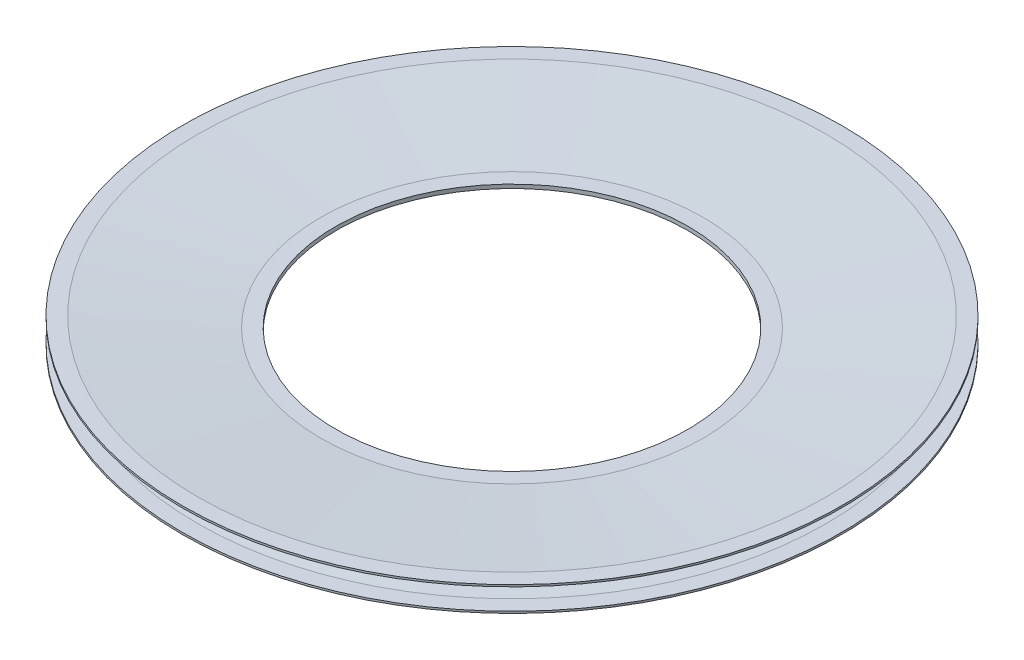
ISO-10303-21;
HEADER;
FILE_DESCRIPTION(('STEP AP214'),'2;1');
FILE_NAME('part.step','',(''),(''),'','','');
FILE_SCHEMA(('AUTOMOTIVE_DESIGN { 1 0 10303 214 1 1 1 1 }'));
ENDSEC;
DATA;
#1=APPLICATION_CONTEXT('core data for automotive mechanical design processes');
#2=APPLICATION_PROTOCOL_DEFINITION('international standard','automotive_design',2000,#1);
#3=PRODUCT_CONTEXT('',#1,'mechanical');
#4=PRODUCT('Part','Part','',(#3));
#5=PRODUCT_RELATED_PRODUCT_CATEGORY('part','',(#4));
#6=PRODUCT_DEFINITION_FORMATION('','',#4);
#7=PRODUCT_DEFINITION_CONTEXT('part definition',#1,'design');
#8=PRODUCT_DEFINITION('design','',#6,#7);
#9=PRODUCT_DEFINITION_SHAPE('','',#8);
#10=(LENGTH_UNIT() NAMED_UNIT(*) SI_UNIT(.MILLI.,.METRE.));
#11=(NAMED_UNIT(*) PLANE_ANGLE_UNIT() SI_UNIT($,.RADIAN.));
#12=(NAMED_UNIT(*) SI_UNIT($,.STERADIAN.) SOLID_ANGLE_UNIT());
#13=UNCERTAINTY_MEASURE_WITH_UNIT(LENGTH_MEASURE(1.E-05),#10,'distance_accuracy_value','');
#14=(GEOMETRIC_REPRESENTATION_CONTEXT(3) GLOBAL_UNCERTAINTY_ASSIGNED_CONTEXT((#13)) GLOBAL_UNIT_ASSIGNED_CONTEXT((#10,
#11,#12)) REPRESENTATION_CONTEXT('',''));
#15=CARTESIAN_POINT('',(0.,0.,0.));
#16=DIRECTION('',(0.,0.,1.));
#17=DIRECTION('',(1.,0.,0.));
#18=AXIS2_PLACEMENT_3D('',#15,#16,#17);
#19=CARTESIAN_POINT('',(0.,0.,0.));
#20=DIRECTION('',(0.,1.,0.));
#21=DIRECTION('',(0.,0.,-1.));
#22=AXIS2_PLACEMENT_3D('',#19,#20,#21);
#23=CYLINDRICAL_SURFACE('',#22,13.081);
#24=CARTESIAN_POINT('',(0.,14.4112109031421,0.));
#25=DIRECTION('',(0.,-1.,0.));
#26=DIRECTION('',(0.,0.,-1.));
#27=AXIS2_PLACEMENT_3D('',#24,#25,#26);
#28=CIRCLE('',#27,13.081);
#29=CARTESIAN_POINT('',(0.,14.4112109031421,-13.081));
#30=VERTEX_POINT('',#29);
#31=EDGE_CURVE('E11',#30,#30,#28,.T.);
#32=ORIENTED_EDGE('',*,*,#31,.F.);
#33=EDGE_LOOP('',(#32));
#34=FACE_BOUND('',#33,.T.);
#35=CARTESIAN_POINT('',(0.,14.4874109031421,0.));
#36=DIRECTION('',(0.,-1.,0.));
#37=DIRECTION('',(0.,0.,-1.));
#38=AXIS2_PLACEMENT_3D('',#35,#36,#37);
#39=CIRCLE('',#38,13.081);
#40=CARTESIAN_POINT('',(0.,14.4874109031421,-13.081));
#41=VERTEX_POINT('',#40);
#42=EDGE_CURVE('E90',#41,#41,#39,.T.);
#43=ORIENTED_EDGE('',*,*,#42,.T.);
#44=EDGE_LOOP('',(#43));
#45=FACE_BOUND('',#44,.T.);
#46=ADVANCED_FACE('F16',(#34,#45),#23,.T.);
#47=CARTESIAN_POINT('',(-12.4746660164987,15.3256109031421,0.));
#48=DIRECTION('',(0.,1.,0.));
#49=DIRECTION('',(1.,0.,0.));
#50=AXIS2_PLACEMENT_3D('',#47,#48,#49);
#51=PLANE('',#50);
#52=CARTESIAN_POINT('',(0.,15.3256109031421,0.));
#53=DIRECTION('',(0.,-1.,0.));
#54=DIRECTION('',(0.,0.,-1.));
#55=AXIS2_PLACEMENT_3D('',#52,#53,#54);
#56=CIRCLE('',#55,12.4746660164987);
#57=CARTESIAN_POINT('',(0.,15.3256109031421,-12.4746660164987));
#58=VERTEX_POINT('',#57);
#59=EDGE_CURVE('E79',#58,#58,#56,.T.);
#60=ORIENTED_EDGE('',*,*,#59,.F.);
#61=EDGE_LOOP('',(#60));
#62=FACE_BOUND('',#61,.T.);
#63=CARTESIAN_POINT('',(0.,15.3256109031421,0.));
#64=DIRECTION('',(0.,-1.,0.));
#65=DIRECTION('',(0.,0.,-1.));
#66=AXIS2_PLACEMENT_3D('',#63,#64,#65);
#67=CIRCLE('',#66,13.081);
#68=CARTESIAN_POINT('',(0.,15.3256109031421,-13.081));
#69=VERTEX_POINT('',#68);
#70=EDGE_CURVE('E99',#69,#69,#67,.T.);
#71=ORIENTED_EDGE('',*,*,#70,.T.);
#72=EDGE_LOOP('',(#71));
#73=FACE_BOUND('',#72,.T.);
#74=ADVANCED_FACE('F121',(#62,#73),#51,.F.);
#75=CARTESIAN_POINT('',(-12.4714,14.4112109031421,0.));
#76=DIRECTION('',(0.,1.,0.));
#77=DIRECTION('',(1.,0.,0.));
#78=AXIS2_PLACEMENT_3D('',#75,#76,#77);
#79=PLANE('',#78);
#80=CARTESIAN_POINT('',(0.,14.4112109031421,0.));
#81=DIRECTION('',(0.,-1.,0.));
#82=DIRECTION('',(0.,0.,-1.));
#83=AXIS2_PLACEMENT_3D('',#80,#81,#82);
#84=CIRCLE('',#83,12.4714);
#85=CARTESIAN_POINT('',(0.,14.4112109031421,-12.4714));
#86=VERTEX_POINT('',#85);
#87=EDGE_CURVE('E163',#86,#86,#84,.T.);
#88=ORIENTED_EDGE('',*,*,#87,.F.);
#89=EDGE_LOOP('',(#88));
#90=FACE_BOUND('',#89,.T.);
#91=ORIENTED_EDGE('',*,*,#31,.T.);
#92=EDGE_LOOP('',(#91));
#93=FACE_BOUND('',#92,.T.);
#94=ADVANCED_FACE('F111',(#90,#93),#79,.F.);
#95=CARTESIAN_POINT('',(0.,14.9065109031421,0.));
#96=DIRECTION('',(0.,-1.,0.));
#97=DIRECTION('',(0.,0.,-1.));
#98=AXIS2_PLACEMENT_3D('',#95,#96,#97);
#99=CONICAL_SURFACE('',#98,7.5946,1.48512654390186);
#100=CARTESIAN_POINT('',(0.,14.9065109031421,0.));
#101=DIRECTION('',(0.,-1.,0.));
#102=DIRECTION('',(0.,0.,-1.));
#103=AXIS2_PLACEMENT_3D('',#100,#101,#102);
#104=CIRCLE('',#103,7.5946);
#105=CARTESIAN_POINT('',(0.,14.9065109031421,-7.5946));
#106=VERTEX_POINT('',#105);
#107=EDGE_CURVE('E85',#106,#106,#104,.T.);
#108=ORIENTED_EDGE('',*,*,#107,.T.);
#109=EDGE_LOOP('',(#108));
#110=FACE_BOUND('',#109,.T.);
#111=CARTESIAN_POINT('',(0.,14.4874109031421,0.));
#112=DIRECTION('',(0.,-1.,0.));
#113=DIRECTION('',(0.,0.,-1.));
#114=AXIS2_PLACEMENT_3D('',#111,#112,#113);
#115=CIRCLE('',#114,12.4746660164987);
#116=CARTESIAN_POINT('',(0.,14.4874109031421,-12.4746660164987));
#117=VERTEX_POINT('',#116);
#118=EDGE_CURVE('E25',#117,#117,#115,.T.);
#119=ORIENTED_EDGE('',*,*,#118,.F.);
#120=EDGE_LOOP('',(#119));
#121=FACE_BOUND('',#120,.T.);
#122=ADVANCED_FACE('F86',(#110,#121),#99,.T.);
#123=CARTESIAN_POINT('',(-12.4746660164987,14.4874109031421,0.));
#124=DIRECTION('',(0.,-1.,0.));
#125=DIRECTION('',(0.,0.,-1.));
#126=AXIS2_PLACEMENT_3D('',#123,#124,#125);
#127=PLANE('',#126);
#128=ORIENTED_EDGE('',*,*,#118,.T.);
#129=EDGE_LOOP('',(#128));
#130=FACE_BOUND('',#129,.T.);
#131=ORIENTED_EDGE('',*,*,#42,.F.);
#132=EDGE_LOOP('',(#131));
#133=FACE_BOUND('',#132,.T.);
#134=ADVANCED_FACE('F108',(#130,#133),#127,.F.);
#135=CARTESIAN_POINT('',(-12.4714,15.4018109031422,0.));
#136=DIRECTION('',(0.,-1.,0.));
#137=DIRECTION('',(0.,0.,-1.));
#138=AXIS2_PLACEMENT_3D('',#135,#136,#137);
#139=PLANE('',#138);
#140=CARTESIAN_POINT('',(0.,15.4018109031422,0.));
#141=DIRECTION('',(0.,-1.,0.));
#142=DIRECTION('',(0.,0.,-1.));
#143=AXIS2_PLACEMENT_3D('',#140,#141,#142);
#144=CIRCLE('',#143,12.4714);
#145=CARTESIAN_POINT('',(0.,15.4018109031422,-12.4714));
#146=VERTEX_POINT('',#145);
#147=EDGE_CURVE('E159',#146,#146,#144,.T.);
#148=ORIENTED_EDGE('',*,*,#147,.T.);
#149=EDGE_LOOP('',(#148));
#150=FACE_BOUND('',#149,.T.);
#151=CARTESIAN_POINT('',(0.,15.4018109031422,0.));
#152=DIRECTION('',(0.,-1.,0.));
#153=DIRECTION('',(0.,0.,-1.));
#154=AXIS2_PLACEMENT_3D('',#151,#152,#153);
#155=CIRCLE('',#154,13.081);
#156=CARTESIAN_POINT('',(0.,15.4018109031422,-13.081));
#157=VERTEX_POINT('',#156);
#158=EDGE_CURVE('E102',#157,#157,#155,.T.);
#159=ORIENTED_EDGE('',*,*,#158,.F.);
#160=EDGE_LOOP('',(#159));
#161=FACE_BOUND('',#160,.T.);
#162=ADVANCED_FACE('F119',(#150,#161),#139,.F.);
#163=CARTESIAN_POINT('',(-6.985,14.9827109031421,0.));
#164=DIRECTION('',(0.,-1.,0.));
#165=DIRECTION('',(0.,0.,-1.));
#166=AXIS2_PLACEMENT_3D('',#163,#164,#165);
#167=PLANE('',#166);
#168=CARTESIAN_POINT('',(0.,14.9827109031421,0.));
#169=DIRECTION('',(0.,-1.,0.));
#170=DIRECTION('',(0.,0.,-1.));
#171=AXIS2_PLACEMENT_3D('',#168,#169,#170);
#172=CIRCLE('',#171,6.985);
#173=CARTESIAN_POINT('',(0.,14.9827109031421,-6.985));
#174=VERTEX_POINT('',#173);
#175=EDGE_CURVE('E154',#174,#174,#172,.T.);
#176=ORIENTED_EDGE('',*,*,#175,.T.);
#177=EDGE_LOOP('',(#176));
#178=FACE_BOUND('',#177,.T.);
#179=CARTESIAN_POINT('',(0.,14.9827109031421,0.));
#180=DIRECTION('',(0.,-1.,0.));
#181=DIRECTION('',(0.,0.,-1.));
#182=AXIS2_PLACEMENT_3D('',#179,#180,#181);
#183=CIRCLE('',#182,7.59133398350129);
#184=CARTESIAN_POINT('',(0.,14.9827109031421,-7.59133398350129));
#185=VERTEX_POINT('',#184);
#186=EDGE_CURVE('E156',#185,#185,#183,.T.);
#187=ORIENTED_EDGE('',*,*,#186,.F.);
#188=EDGE_LOOP('',(#187));
#189=FACE_BOUND('',#188,.T.);
#190=ADVANCED_FACE('F141',(#178,#189),#167,.F.);
#191=CARTESIAN_POINT('',(0.,15.3256109031421,0.));
#192=DIRECTION('',(0.,1.,0.));
#193=DIRECTION('',(0.,0.,1.));
#194=AXIS2_PLACEMENT_3D('',#191,#192,#193);
#195=CONICAL_SURFACE('',#194,12.4746660164987,1.48512654390186);
#196=ORIENTED_EDGE('',*,*,#107,.F.);
#197=EDGE_LOOP('',(#196));
#198=FACE_BOUND('',#197,.T.);
#199=ORIENTED_EDGE('',*,*,#59,.T.);
#200=EDGE_LOOP('',(#199));
#201=FACE_BOUND('',#200,.T.);
#202=ADVANCED_FACE('F144',(#198,#201),#195,.T.);
#203=CARTESIAN_POINT('',(0.,0.,0.));
#204=DIRECTION('',(0.,1.,0.));
#205=DIRECTION('',(0.,0.,-1.));
#206=AXIS2_PLACEMENT_3D('',#203,#204,#205);
#207=CYLINDRICAL_SURFACE('',#206,13.081);
#208=ORIENTED_EDGE('',*,*,#70,.F.);
#209=EDGE_LOOP('',(#208));
#210=FACE_BOUND('',#209,.T.);
#211=ORIENTED_EDGE('',*,*,#158,.T.);
#212=EDGE_LOOP('',(#211));
#213=FACE_BOUND('',#212,.T.);
#214=ADVANCED_FACE('F150',(#210,#213),#207,.T.);
#215=CARTESIAN_POINT('',(0.,14.9827109031421,0.));
#216=DIRECTION('',(0.,1.,0.));
#217=DIRECTION('',(0.,0.,1.));
#218=AXIS2_PLACEMENT_3D('',#215,#216,#217);
#219=CONICAL_SURFACE('',#218,7.59133398350129,1.48512654390186);
#220=ORIENTED_EDGE('',*,*,#186,.T.);
#221=EDGE_LOOP('',(#220));
#222=FACE_BOUND('',#221,.T.);
#223=ORIENTED_EDGE('',*,*,#147,.F.);
#224=EDGE_LOOP('',(#223));
#225=FACE_BOUND('',#224,.T.);
#226=ADVANCED_FACE('F249',(#222,#225),#219,.F.);
#227=CARTESIAN_POINT('',(0.,14.4112109031421,0.));
#228=DIRECTION('',(0.,-1.,0.));
#229=DIRECTION('',(0.,0.,-1.));
#230=AXIS2_PLACEMENT_3D('',#227,#228,#229);
#231=CONICAL_SURFACE('',#230,12.4714,1.48512654390186);
#232=CARTESIAN_POINT('',(0.,14.8303109031421,0.));
#233=DIRECTION('',(0.,-1.,0.));
#234=DIRECTION('',(0.,0.,-1.));
#235=AXIS2_PLACEMENT_3D('',#232,#233,#234);
#236=CIRCLE('',#235,7.59133398350129);
#237=CARTESIAN_POINT('',(0.,14.8303109031421,-7.59133398350129));
#238=VERTEX_POINT('',#237);
#239=EDGE_CURVE('E168',#238,#238,#236,.T.);
#240=ORIENTED_EDGE('',*,*,#239,.F.);
#241=EDGE_LOOP('',(#240));
#242=FACE_BOUND('',#241,.T.);
#243=ORIENTED_EDGE('',*,*,#87,.T.);
#244=EDGE_LOOP('',(#243));
#245=FACE_BOUND('',#244,.T.);
#246=ADVANCED_FACE('F240',(#242,#245),#231,.F.);
#247=CARTESIAN_POINT('',(-6.985,14.8303109031421,0.));
#248=DIRECTION('',(0.,1.,0.));
#249=DIRECTION('',(1.,0.,0.));
#250=AXIS2_PLACEMENT_3D('',#247,#248,#249);
#251=PLANE('',#250);
#252=CARTESIAN_POINT('',(0.,14.8303109031421,0.));
#253=DIRECTION('',(0.,-1.,0.));
#254=DIRECTION('',(0.,0.,-1.));
#255=AXIS2_PLACEMENT_3D('',#252,#253,#254);
#256=CIRCLE('',#255,6.985);
#257=CARTESIAN_POINT('',(0.,14.8303109031421,-6.985));
#258=VERTEX_POINT('',#257);
#259=EDGE_CURVE('E173',#258,#258,#256,.T.);
#260=ORIENTED_EDGE('',*,*,#259,.F.);
#261=EDGE_LOOP('',(#260));
#262=FACE_BOUND('',#261,.T.);
#263=ORIENTED_EDGE('',*,*,#239,.T.);
#264=EDGE_LOOP('',(#263));
#265=FACE_BOUND('',#264,.T.);
#266=ADVANCED_FACE('F221',(#262,#265),#251,.F.);
#267=CARTESIAN_POINT('',(0.,0.,0.));
#268=DIRECTION('',(0.,1.,0.));
#269=DIRECTION('',(0.,0.,-1.));
#270=AXIS2_PLACEMENT_3D('',#267,#268,#269);
#271=CYLINDRICAL_SURFACE('',#270,6.985);
#272=ORIENTED_EDGE('',*,*,#259,.T.);
#273=EDGE_LOOP('',(#272));
#274=FACE_BOUND('',#273,.T.);
#275=ORIENTED_EDGE('',*,*,#175,.F.);
#276=EDGE_LOOP('',(#275));
#277=FACE_BOUND('',#276,.T.);
#278=ADVANCED_FACE('F217',(#274,#277),#271,.F.);
#279=CLOSED_SHELL('',(#46,#74,#94,#122,#134,#162,#190,#202,#214,#226,#246,#266,#278));
#280=MANIFOLD_SOLID_BREP('B1',#279);
#281=ADVANCED_BREP_SHAPE_REPRESENTATION('',(#18,#280),#14);
#282=SHAPE_DEFINITION_REPRESENTATION(#9,#281);
ENDSEC;
END-ISO-10303-21;
